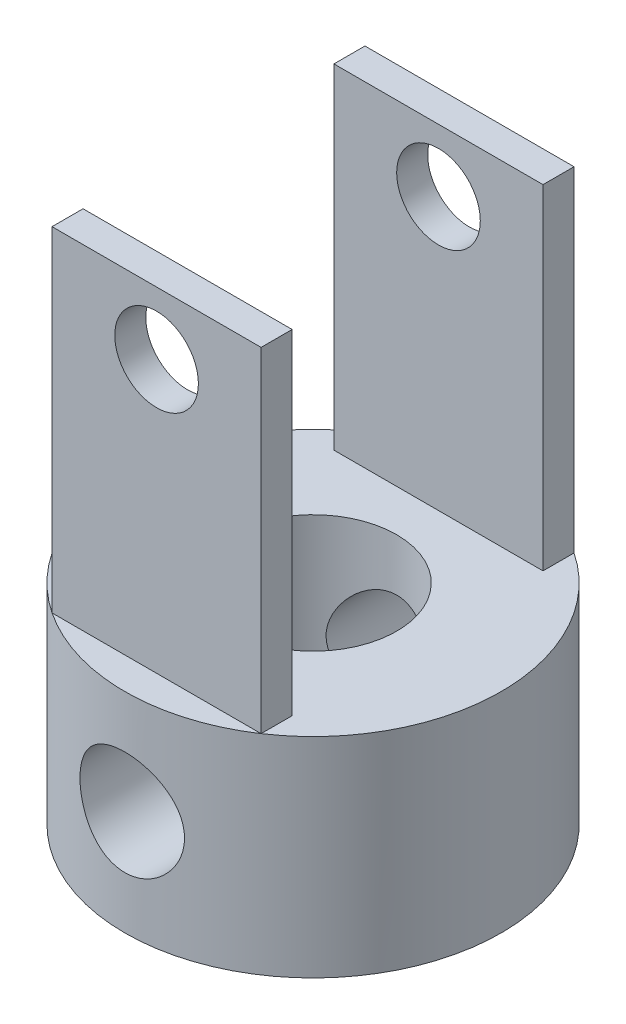
ISO-10303-21;
HEADER;
FILE_DESCRIPTION(('STEP AP214'),'2;1');
FILE_NAME('part.step','',(''),(''),'','','');
FILE_SCHEMA(('AUTOMOTIVE_DESIGN { 1 0 10303 214 1 1 1 1 }'));
ENDSEC;
DATA;
#1=APPLICATION_CONTEXT('core data for automotive mechanical design processes');
#2=APPLICATION_PROTOCOL_DEFINITION('international standard','automotive_design',2000,#1);
#3=PRODUCT_CONTEXT('',#1,'mechanical');
#4=PRODUCT('Part','Part','',(#3));
#5=PRODUCT_RELATED_PRODUCT_CATEGORY('part','',(#4));
#6=PRODUCT_DEFINITION_FORMATION('','',#4);
#7=PRODUCT_DEFINITION_CONTEXT('part definition',#1,'design');
#8=PRODUCT_DEFINITION('design','',#6,#7);
#9=PRODUCT_DEFINITION_SHAPE('','',#8);
#10=(LENGTH_UNIT() NAMED_UNIT(*) SI_UNIT(.MILLI.,.METRE.));
#11=(NAMED_UNIT(*) PLANE_ANGLE_UNIT() SI_UNIT($,.RADIAN.));
#12=(NAMED_UNIT(*) SI_UNIT($,.STERADIAN.) SOLID_ANGLE_UNIT());
#13=UNCERTAINTY_MEASURE_WITH_UNIT(LENGTH_MEASURE(1.E-05),#10,'distance_accuracy_value','');
#14=(GEOMETRIC_REPRESENTATION_CONTEXT(3) GLOBAL_UNCERTAINTY_ASSIGNED_CONTEXT((#13)) GLOBAL_UNIT_ASSIGNED_CONTEXT((#10,
#11,#12)) REPRESENTATION_CONTEXT('',''));
#15=CARTESIAN_POINT('',(0.,0.,0.));
#16=DIRECTION('',(0.,0.,1.));
#17=DIRECTION('',(1.,0.,0.));
#18=AXIS2_PLACEMENT_3D('',#15,#16,#17);
#19=CARTESIAN_POINT('',(0.,5.,0.));
#20=DIRECTION('',(0.,1.,0.));
#21=DIRECTION('',(0.,0.,1.));
#22=AXIS2_PLACEMENT_3D('',#19,#20,#21);
#23=PLANE('',#22);
#24=CARTESIAN_POINT('',(0.,5.,0.));
#25=DIRECTION('',(0.,1.,0.));
#26=DIRECTION('',(0.,0.,1.));
#27=AXIS2_PLACEMENT_3D('',#24,#25,#26);
#28=CIRCLE('',#27,2.);
#29=CARTESIAN_POINT('',(0.,5.,2.));
#30=VERTEX_POINT('',#29);
#31=EDGE_CURVE('E226',#30,#30,#28,.F.);
#32=ORIENTED_EDGE('',*,*,#31,.T.);
#33=EDGE_LOOP('',(#32));
#34=FACE_BOUND('',#33,.T.);
#35=DIRECTION('',(0.,0.,1.));
#36=VECTOR('',#35,1.);
#37=CARTESIAN_POINT('',(-2.5,5.,-3.74165738677394));
#38=LINE('',#37,#36);
#39=CARTESIAN_POINT('',(-2.5,5.,-3.74165738677394));
#40=VERTEX_POINT('',#39);
#41=CARTESIAN_POINT('',(-2.5,5.,-3.));
#42=VERTEX_POINT('',#41);
#43=EDGE_CURVE('E138',#40,#42,#38,.T.);
#44=ORIENTED_EDGE('',*,*,#43,.F.);
#45=CARTESIAN_POINT('',(0.,5.,0.));
#46=DIRECTION('',(0.,1.,0.));
#47=DIRECTION('',(0.,0.,1.));
#48=AXIS2_PLACEMENT_3D('',#45,#46,#47);
#49=CIRCLE('',#48,4.5);
#50=CARTESIAN_POINT('',(-2.5,5.,3.74165738677394));
#51=VERTEX_POINT('',#50);
#52=EDGE_CURVE('E314',#40,#51,#49,.T.);
#53=ORIENTED_EDGE('',*,*,#52,.T.);
#54=DIRECTION('',(0.,0.,1.));
#55=VECTOR('',#54,1.);
#56=CARTESIAN_POINT('',(-2.5,5.,3.74165738677394));
#57=LINE('',#56,#55);
#58=CARTESIAN_POINT('',(-2.5,5.,3.));
#59=VERTEX_POINT('',#58);
#60=EDGE_CURVE('E73',#59,#51,#57,.T.);
#61=ORIENTED_EDGE('',*,*,#60,.F.);
#62=DIRECTION('',(-1.,0.,0.));
#63=VECTOR('',#62,1.);
#64=CARTESIAN_POINT('',(-2.5,5.,3.));
#65=LINE('',#64,#63);
#66=CARTESIAN_POINT('',(2.5,5.,3.));
#67=VERTEX_POINT('',#66);
#68=EDGE_CURVE('E159',#67,#59,#65,.T.);
#69=ORIENTED_EDGE('',*,*,#68,.F.);
#70=DIRECTION('',(0.,0.,-1.));
#71=VECTOR('',#70,1.);
#72=CARTESIAN_POINT('',(2.5,5.,3.74165738677394));
#73=LINE('',#72,#71);
#74=CARTESIAN_POINT('',(2.5,5.,3.74165738677394));
#75=VERTEX_POINT('',#74);
#76=EDGE_CURVE('E161',#75,#67,#73,.T.);
#77=ORIENTED_EDGE('',*,*,#76,.F.);
#78=CARTESIAN_POINT('',(2.5,5.,-3.74165738677394));
#79=VERTEX_POINT('',#78);
#80=EDGE_CURVE('E11',#75,#79,#49,.T.);
#81=ORIENTED_EDGE('',*,*,#80,.T.);
#82=DIRECTION('',(0.,0.,-1.));
#83=VECTOR('',#82,1.);
#84=CARTESIAN_POINT('',(2.5,5.,-3.74165738677394));
#85=LINE('',#84,#83);
#86=CARTESIAN_POINT('',(2.5,5.,-3.));
#87=VERTEX_POINT('',#86);
#88=EDGE_CURVE('E194',#87,#79,#85,.T.);
#89=ORIENTED_EDGE('',*,*,#88,.F.);
#90=DIRECTION('',(1.,0.,0.));
#91=VECTOR('',#90,1.);
#92=CARTESIAN_POINT('',(-2.5,5.,-3.));
#93=LINE('',#92,#91);
#94=EDGE_CURVE('E66',#42,#87,#93,.T.);
#95=ORIENTED_EDGE('',*,*,#94,.F.);
#96=EDGE_LOOP('',(#44,#53,#61,#69,#77,#81,#89,#95));
#97=FACE_BOUND('',#96,.T.);
#98=ADVANCED_FACE('F48',(#34,#97),#23,.T.);
#99=DIRECTION('',(-1.,0.,0.));
#100=VECTOR('',#99,1.);
#101=CARTESIAN_POINT('',(-2.5,5.,-3.74165738677394));
#102=LINE('',#101,#100);
#103=EDGE_CURVE('E135',#79,#40,#102,.T.);
#104=ORIENTED_EDGE('',*,*,#103,.F.);
#105=EDGE_CURVE('E58',#79,#40,#49,.T.);
#106=ORIENTED_EDGE('',*,*,#105,.T.);
#107=EDGE_LOOP('',(#104,#106));
#108=FACE_BOUND('',#107,.T.);
#109=ADVANCED_FACE('F291',(#108),#23,.T.);
#110=CARTESIAN_POINT('',(0.,5.,0.));
#111=DIRECTION('',(0.,-1.,0.));
#112=DIRECTION('',(0.,0.,-1.));
#113=AXIS2_PLACEMENT_3D('',#110,#111,#112);
#114=CYLINDRICAL_SURFACE('',#113,4.5);
#115=CARTESIAN_POINT('',(0.,3.75,-4.5));
#116=CARTESIAN_POINT('',(-0.0688012508831791,3.74999860041477,-4.49999908016929));
#117=CARTESIAN_POINT('',(-0.137617123752667,3.74430068019471,-4.49840674086833));
#118=CARTESIAN_POINT('',(-0.273259475994238,3.72170427173468,-4.49220950198236));
#119=CARTESIAN_POINT('',(-0.340085103663439,3.70480105828628,-4.48760333149253));
#120=CARTESIAN_POINT('',(-0.469769949680301,3.66039128058608,-4.47588565394594));
#121=CARTESIAN_POINT('',(-0.53263439009567,3.63289903130159,-4.46877753030964));
#122=CARTESIAN_POINT('',(-0.652860695241772,3.56814649367313,-4.45280312581996));
#123=CARTESIAN_POINT('',(-0.710222070812297,3.53088533808074,-4.44393668888688));
#124=CARTESIAN_POINT('',(-0.819246784715924,3.44667056615714,-4.4251515781749));
#125=CARTESIAN_POINT('',(-0.870753112808474,3.39951796031246,-4.41521373623696));
#126=CARTESIAN_POINT('',(-0.965238185696338,3.29728372287841,-4.39552607117256));
#127=CARTESIAN_POINT('',(-1.00821573084554,3.24220097772477,-4.38577627467018));
#128=CARTESIAN_POINT('',(-1.08520808580323,3.12439273987068,-4.36737044294547));
#129=CARTESIAN_POINT('',(-1.11903874947837,3.06154279155628,-4.35873847945984));
#130=CARTESIAN_POINT('',(-1.1755895713114,2.93076808235988,-4.34382900808304));
#131=CARTESIAN_POINT('',(-1.19831197336242,2.86284434959184,-4.33755102474248));
#132=CARTESIAN_POINT('',(-1.23144924367956,2.72559721114588,-4.32825883142877));
#133=CARTESIAN_POINT('',(-1.24215036904296,2.65634817836012,-4.32516886003198));
#134=CARTESIAN_POINT('',(-1.25183427077972,2.51697411443717,-4.32237649384804));
#135=CARTESIAN_POINT('',(-1.25081944027303,2.4468492651188,-4.3226734072502));
#136=CARTESIAN_POINT('',(-1.2373267133762,2.30997772127729,-4.32655366801453));
#137=CARTESIAN_POINT('',(-1.22519902270671,2.24319319850379,-4.33003660668585));
#138=CARTESIAN_POINT('',(-1.19038731201905,2.11264637140841,-4.33973517053475));
#139=CARTESIAN_POINT('',(-1.16770238457158,2.04888432739775,-4.3459510306134));
#140=CARTESIAN_POINT('',(-1.11214373134465,1.92529776854472,-4.36050069775752));
#141=CARTESIAN_POINT('',(-1.07915021836991,1.86553013318995,-4.36885918600197));
#142=CARTESIAN_POINT('',(-1.00399440679635,1.75225842440876,-4.386739506843));
#143=CARTESIAN_POINT('',(-0.961830166290601,1.69875568127386,-4.39626158564316));
#144=CARTESIAN_POINT('',(-0.86775561028444,1.59753611956358,-4.41581072126827));
#145=CARTESIAN_POINT('',(-0.815552279702356,1.55009236512015,-4.42584370037791));
#146=CARTESIAN_POINT('',(-0.703806607201035,1.46457426922219,-4.44498199810829));
#147=CARTESIAN_POINT('',(-0.644263925421965,1.42650036189752,-4.45408727373461));
#148=CARTESIAN_POINT('',(-0.519083429338114,1.36066818436993,-4.47040839712755));
#149=CARTESIAN_POINT('',(-0.453416395747747,1.3329628960611,-4.47761448645532));
#150=CARTESIAN_POINT('',(-0.318109988769714,1.28906590155863,-4.48925492501446));
#151=CARTESIAN_POINT('',(-0.24847156412113,1.27287145784343,-4.493689933237));
#152=CARTESIAN_POINT('',(-0.109526607713142,1.25289286322103,-4.49918736483408));
#153=CARTESIAN_POINT('',(-0.0402773058586808,1.24873785509283,-4.5003505382403));
#154=CARTESIAN_POINT('',(0.0979299306365675,1.25192699829243,-4.49946480293159));
#155=CARTESIAN_POINT('',(0.166887897284519,1.25926985164805,-4.49741625678167));
#156=CARTESIAN_POINT('',(0.301206913470861,1.28494333411964,-4.49040265059029));
#157=CARTESIAN_POINT('',(0.366611288163868,1.30306394505752,-4.4854933716758));
#158=CARTESIAN_POINT('',(0.493443118118722,1.3495318676381,-4.47331829169354));
#159=CARTESIAN_POINT('',(0.554870123972382,1.37788033256951,-4.46605222488463));
#160=CARTESIAN_POINT('',(0.673420140405416,1.4446658780465,-4.44973740284175));
#161=CARTESIAN_POINT('',(0.730427061953541,1.48330052432267,-4.44065471340565));
#162=CARTESIAN_POINT('',(0.837277670587,1.56931613580746,-4.42175477128212));
#163=CARTESIAN_POINT('',(0.887119814631375,1.61669898006576,-4.41193736105189));
#164=CARTESIAN_POINT('',(0.979812026944951,1.72060144387835,-4.39229842684379));
#165=CARTESIAN_POINT('',(1.02239957885383,1.77735745155757,-4.3824860820796));
#166=CARTESIAN_POINT('',(1.09745581429008,1.89742063787973,-4.36429693304267));
#167=CARTESIAN_POINT('',(1.12992488482463,1.9607275658426,-4.35592007387163));
#168=CARTESIAN_POINT('',(1.18358105834153,2.09180716988317,-4.34164798956173));
#169=CARTESIAN_POINT('',(1.20483077484783,2.15955263775464,-4.3357390309604));
#170=CARTESIAN_POINT('',(1.23557652495357,2.29784970941676,-4.32707876892783));
#171=CARTESIAN_POINT('',(1.24507587906573,2.36840051463312,-4.32432657344887));
#172=CARTESIAN_POINT('',(1.25184859974321,2.50760577949078,-4.32237038329875));
#173=CARTESIAN_POINT('',(1.24954571014582,2.57623819001194,-4.32304340461176));
#174=CARTESIAN_POINT('',(1.23377143287258,2.71209489379468,-4.32757137052124));
#175=CARTESIAN_POINT('',(1.2203003804941,2.77931922926824,-4.33142621959091));
#176=CARTESIAN_POINT('',(1.18282724248614,2.90986723391807,-4.34180718808003));
#177=CARTESIAN_POINT('',(1.15892214641117,2.97322084264776,-4.34830866913275));
#178=CARTESIAN_POINT('',(1.10133451670734,3.09506742250732,-4.36324916052054));
#179=CARTESIAN_POINT('',(1.06765033358688,3.15355957148569,-4.37168849767404));
#180=CARTESIAN_POINT('',(0.990206962020971,3.26602765282517,-4.38988810785379));
#181=CARTESIAN_POINT('',(0.946162084346266,3.31980147668272,-4.39968178982262));
#182=CARTESIAN_POINT('',(0.849781527450663,3.41933237205346,-4.41930831909362));
#183=CARTESIAN_POINT('',(0.797443795628191,3.46508745289098,-4.4291411755031));
#184=CARTESIAN_POINT('',(0.684460232307881,3.54835813657808,-4.44801839581548));
#185=CARTESIAN_POINT('',(0.623646258932174,3.58565162331068,-4.45703841192792));
#186=CARTESIAN_POINT('',(0.496361982692841,3.64942813928948,-4.47299974900605));
#187=CARTESIAN_POINT('',(0.429895030176724,3.67591751858102,-4.47994229035336));
#188=CARTESIAN_POINT('',(0.3031454837667,3.7142200807347,-4.4901607483195));
#189=CARTESIAN_POINT('',(0.243364402168741,3.72760478759287,-4.49382245661855));
#190=CARTESIAN_POINT('',(0.122392625693409,3.74549484582254,-4.49874234976285));
#191=CARTESIAN_POINT('',(0.0612020980194152,3.75000124499993,-4.50000081823467));
#192=CARTESIAN_POINT('',(0.,3.75,-4.5));
#193=B_SPLINE_CURVE_WITH_KNOTS('',3,(#115,#116,#117,#118,#119,#120,#121,#122,#123,#124,#125,
#126,#127,#128,#129,#130,#131,#132,#133,#134,#135,#136,#137,#138,#139,#140,#141,#142,#143,#144,
#145,#146,#147,#148,#149,#150,#151,#152,#153,#154,#155,#156,#157,#158,#159,#160,#161,#162,#163,
#164,#165,#166,#167,#168,#169,#170,#171,#172,#173,#174,#175,#176,#177,#178,#179,#180,#181,#182,
#183,#184,#185,#186,#187,#188,#189,#190,#191,#192),.UNSPECIFIED.,.T.,.F.,(4,2,2,2,2,2,2,2,2,2,2,
2,2,2,2,2,2,2,2,2,2,2,2,2,2,2,2,2,2,2,2,2,2,2,2,2,2,2,4),(0.,0.20617919309949,0.412445386147261,
0.618433707942854,0.824440322837931,1.03507624325264,1.24574177043995,1.46037690323672,
1.67496866133384,1.88433431939189,2.09365721284144,2.29660232990422,2.49956489399153,
2.70497960040655,2.91043784592675,3.12319493838161,3.33596188658146,3.54980165635949,
3.76359055350007,3.97072010588426,4.17782627748477,4.38102317477486,4.58424299163038,
4.79168948884226,4.99918059600964,5.21305991702851,5.426931056682,5.63959564853972,
5.85220013017267,6.05722599244308,6.26224569952548,6.46539893556025,6.66858645848128,
6.8782191327377,7.0879037754062,7.30258090584732,7.51713167871718,7.70055986525029,
7.88396640253934),.UNSPECIFIED.);
#194=CARTESIAN_POINT('',(0.,3.75,-4.5));
#195=VERTEX_POINT('',#194);
#196=EDGE_CURVE('E321',#195,#195,#193,.T.);
#197=ORIENTED_EDGE('',*,*,#196,.T.);
#198=EDGE_LOOP('',(#197));
#199=FACE_BOUND('',#198,.T.);
#200=CARTESIAN_POINT('',(1.25,2.5,4.32290411644765));
#201=CARTESIAN_POINT('',(1.24999857498244,2.43125652335593,4.32290518747009));
#202=CARTESIAN_POINT('',(1.24430988712604,2.36249837996371,4.32456180468303));
#203=CARTESIAN_POINT('',(1.22175346858591,2.22697570228416,4.33098737036507));
#204=CARTESIAN_POINT('',(1.20488074482037,2.1602120723611,4.3357577089319));
#205=CARTESIAN_POINT('',(1.16056004340388,2.03065883662032,4.34782967711429));
#206=CARTESIAN_POINT('',(1.13312779872145,1.96786347962317,4.35512753927727));
#207=CARTESIAN_POINT('',(1.06851688708743,1.84775453897228,4.37142737531087));
#208=CARTESIAN_POINT('',(1.03133723028468,1.79044151285728,4.38042952222604));
#209=CARTESIAN_POINT('',(0.947207659537757,1.68136907220858,4.39939741122667));
#210=CARTESIAN_POINT('',(0.900040389354681,1.62978044118192,4.40938137769938));
#211=CARTESIAN_POINT('',(0.797741434800139,1.53513458048033,4.42903119907275));
#212=CARTESIAN_POINT('',(0.74260886547861,1.4920783000175,4.43869701848036));
#213=CARTESIAN_POINT('',(0.624750214452997,1.41499776941939,4.45682601370986));
#214=CARTESIAN_POINT('',(0.561908163805416,1.3811447040778,4.46526519213644));
#215=CARTESIAN_POINT('',(0.431150181024712,1.32455036312015,4.47978009156482));
#216=CARTESIAN_POINT('',(0.363235182945446,1.30180704771302,4.48585624638467));
#217=CARTESIAN_POINT('',(0.226043180102931,1.26863452726371,4.49483159170207));
#218=CARTESIAN_POINT('',(0.156841487533508,1.25791447886935,4.49780569025352));
#219=CARTESIAN_POINT('',(0.0175622284393639,1.24817627167198,4.50050433692141));
#220=CARTESIAN_POINT('',(-0.0525151772113885,1.24915599422164,4.50022947337466));
#221=CARTESIAN_POINT('',(-0.189527123576272,1.26258777619191,4.49651543187109));
#222=CARTESIAN_POINT('',(-0.256495205022549,1.27472538198454,4.49316299037632));
#223=CARTESIAN_POINT('',(-0.38740374166124,1.30961856911628,4.48377380049515));
#224=CARTESIAN_POINT('',(-0.451344017003044,1.33237478032754,4.47773689287315));
#225=CARTESIAN_POINT('',(-0.575166795899741,1.38809104029157,4.46353125303123));
#226=CARTESIAN_POINT('',(-0.634999513293939,1.42115595476214,4.45534075392173));
#227=CARTESIAN_POINT('',(-0.748372286544129,1.49646980790988,4.43770610675039));
#228=CARTESIAN_POINT('',(-0.801911023420063,1.53872066634598,4.42826169679617));
#229=CARTESIAN_POINT('',(-0.903053380191149,1.63286432888863,4.40876831613152));
#230=CARTESIAN_POINT('',(-0.950400625294905,1.6850309028229,4.39870968477246));
#231=CARTESIAN_POINT('',(-1.03574054042556,1.79666633756107,4.37940191575936));
#232=CARTESIAN_POINT('',(-1.07373253513777,1.85613572505908,4.37015283657441));
#233=CARTESIAN_POINT('',(-1.13950119060979,1.98128236070626,4.35347006971972));
#234=CARTESIAN_POINT('',(-1.16720250820497,2.04700113465338,4.34604990034145));
#235=CARTESIAN_POINT('',(-1.21107648821783,2.18242179787883,4.33403011245413));
#236=CARTESIAN_POINT('',(-1.22725229229959,2.25212259612334,4.32942972536695));
#237=CARTESIAN_POINT('',(-1.2471622774305,2.39111725699411,4.3237357416584));
#238=CARTESIAN_POINT('',(-1.25128124671117,2.46035161739731,4.32253373160699));
#239=CARTESIAN_POINT('',(-1.24802546030741,2.59852099522208,4.32347494363827));
#240=CARTESIAN_POINT('',(-1.24065204762324,2.66745604667692,4.3256177748427));
#241=CARTESIAN_POINT('',(-1.21496120714199,2.80154887335,4.33290194955527));
#242=CARTESIAN_POINT('',(-1.19688029932166,2.86675583442476,4.33797843412407));
#243=CARTESIAN_POINT('',(-1.15055629594164,2.99321011354927,4.35049332079077));
#244=CARTESIAN_POINT('',(-1.12231179178945,3.05445688135949,4.35793205025995));
#245=CARTESIAN_POINT('',(-1.05569785607915,3.17284768427921,4.3745518120738));
#246=CARTESIAN_POINT('',(-1.01710533632441,3.22986088551919,4.38376979927329));
#247=CARTESIAN_POINT('',(-0.931163609237379,3.33674312203778,4.40282499705416));
#248=CARTESIAN_POINT('',(-0.883812610803321,3.38661069233221,4.41266233402014));
#249=CARTESIAN_POINT('',(-0.779908718233593,3.47941073528424,4.43222509969555));
#250=CARTESIAN_POINT('',(-0.723111799354903,3.52207340503389,4.44193710647942));
#251=CARTESIAN_POINT('',(-0.602941556434743,3.59726198553872,4.45983701439328));
#252=CARTESIAN_POINT('',(-0.539568581085917,3.62978843339709,4.46802499626981));
#253=CARTESIAN_POINT('',(-0.408489197616628,3.6834747959117,4.48190163893738));
#254=CARTESIAN_POINT('',(-0.340820050525332,3.70472058303361,4.48760911989691));
#255=CARTESIAN_POINT('',(-0.202688156447679,3.73548408672038,4.49596471419449));
#256=CARTESIAN_POINT('',(-0.132226089798137,3.74500464157181,4.49861356791422));
#257=CARTESIAN_POINT('',(0.0069800761788269,3.75185716484314,4.50051521104671));
#258=CARTESIAN_POINT('',(0.075703532294838,3.74958335354531,4.49987784493188));
#259=CARTESIAN_POINT('',(0.211750309863845,3.73383571875471,4.49553044423232));
#260=CARTESIAN_POINT('',(0.279073691936855,3.7203623812151,4.49182054296648));
#261=CARTESIAN_POINT('',(0.409892491734703,3.68282838818581,4.48176992045676));
#262=CARTESIAN_POINT('',(0.473414328140757,3.6588537010331,4.47545058468407));
#263=CARTESIAN_POINT('',(0.59556960394138,3.6010740308847,4.46083910148551));
#264=CARTESIAN_POINT('',(0.654202313356983,3.56726758331173,4.45254666017165));
#265=CARTESIAN_POINT('',(0.766725560865268,3.4896640286411,4.43457698674557));
#266=CARTESIAN_POINT('',(0.820433633237658,3.44560995696169,4.424867058695));
#267=CARTESIAN_POINT('',(0.919827817865878,3.34924103477822,4.40527960400557));
#268=CARTESIAN_POINT('',(0.965511754330254,3.29692395099116,4.39540203270303));
#269=CARTESIAN_POINT('',(1.04867120954826,3.18397774126432,4.37631776775268));
#270=CARTESIAN_POINT('',(1.08591898377728,3.12317680517996,4.36713335303392));
#271=CARTESIAN_POINT('',(1.14961326326322,2.99592800635586,4.35080192911572));
#272=CARTESIAN_POINT('',(1.17606625417817,2.92948356339495,4.3436536973308));
#273=CARTESIAN_POINT('',(1.21429747440485,2.80281993514138,4.33310672877768));
#274=CARTESIAN_POINT('',(1.22765281702807,2.74310529722462,4.32931330336832));
#275=CARTESIAN_POINT('',(1.2455041024603,2.62226417588502,4.32421169234928));
#276=CARTESIAN_POINT('',(1.25000126735755,2.56113788839299,4.32290316392016));
#277=CARTESIAN_POINT('',(1.25,2.5,4.32290411644765));
#278=B_SPLINE_CURVE_WITH_KNOTS('',3,(#200,#201,#202,#203,#204,#205,#206,#207,#208,#209,#210,
#211,#212,#213,#214,#215,#216,#217,#218,#219,#220,#221,#222,#223,#224,#225,#226,#227,#228,#229,
#230,#231,#232,#233,#234,#235,#236,#237,#238,#239,#240,#241,#242,#243,#244,#245,#246,#247,#248,
#249,#250,#251,#252,#253,#254,#255,#256,#257,#258,#259,#260,#261,#262,#263,#264,#265,#266,#267,
#268,#269,#270,#271,#272,#273,#274,#275,#276,#277),.UNSPECIFIED.,.T.,.F.,(4,2,2,2,2,2,2,2,2,2,2,
2,2,2,2,2,2,2,2,2,2,2,2,2,2,2,2,2,2,2,2,2,2,2,2,2,2,2,4),(0.,0.20600539584448,0.412102824227257,
0.617894362639286,0.823706807313081,1.03456947880015,1.24545559531203,1.46003098375315,
1.67456696053961,1.8837931561237,2.09298146465861,2.29644933759041,2.49992928132028,
2.70555066651715,2.91121506564783,3.12371437775741,3.336229024771,3.55027028703842,
3.76425318285945,3.97132818882307,4.17837899780676,4.38101838846584,4.58368587413355,
4.79113333818944,4.99862327207956,5.2126875312967,5.42674044564049,5.63913966265412,
5.85148745480915,6.05678432365223,6.26207228502411,6.46571019932815,6.66937846387956,
6.87884344725019,7.08836514088847,7.30300439729128,7.51751450485885,7.70075331478743,
7.88396684302815),.UNSPECIFIED.);
#279=CARTESIAN_POINT('',(1.25,2.5,4.32290411644765));
#280=VERTEX_POINT('',#279);
#281=EDGE_CURVE('E232',#280,#280,#278,.T.);
#282=ORIENTED_EDGE('',*,*,#281,.T.);
#283=EDGE_LOOP('',(#282));
#284=FACE_BOUND('',#283,.T.);
#285=ORIENTED_EDGE('',*,*,#80,.F.);
#286=EDGE_CURVE('E59',#51,#75,#49,.T.);
#287=ORIENTED_EDGE('',*,*,#286,.F.);
#288=ORIENTED_EDGE('',*,*,#52,.F.);
#289=ORIENTED_EDGE('',*,*,#105,.F.);
#290=EDGE_LOOP('',(#285,#287,#288,#289));
#291=FACE_BOUND('',#290,.T.);
#292=CARTESIAN_POINT('',(0.,0.,0.));
#293=DIRECTION('',(0.,1.,0.));
#294=DIRECTION('',(0.,0.,1.));
#295=AXIS2_PLACEMENT_3D('',#292,#293,#294);
#296=CIRCLE('',#295,4.5);
#297=CARTESIAN_POINT('',(0.,0.,4.5));
#298=VERTEX_POINT('',#297);
#299=EDGE_CURVE('E53',#298,#298,#296,.T.);
#300=ORIENTED_EDGE('',*,*,#299,.T.);
#301=EDGE_LOOP('',(#300));
#302=FACE_BOUND('',#301,.T.);
#303=ADVANCED_FACE('F50',(#199,#284,#291,#302),#114,.T.);
#304=DIRECTION('',(1.,0.,0.));
#305=VECTOR('',#304,1.);
#306=CARTESIAN_POINT('',(-2.5,5.,3.74165738677394));
#307=LINE('',#306,#305);
#308=EDGE_CURVE('E165',#51,#75,#307,.T.);
#309=ORIENTED_EDGE('',*,*,#308,.F.);
#310=ORIENTED_EDGE('',*,*,#286,.T.);
#311=EDGE_LOOP('',(#309,#310));
#312=FACE_BOUND('',#311,.T.);
#313=ADVANCED_FACE('F288',(#312),#23,.T.);
#314=CARTESIAN_POINT('',(0.,0.,0.));
#315=DIRECTION('',(0.,1.,0.));
#316=DIRECTION('',(0.,0.,1.));
#317=AXIS2_PLACEMENT_3D('',#314,#315,#316);
#318=PLANE('',#317);
#319=CARTESIAN_POINT('',(0.,0.,0.));
#320=DIRECTION('',(0.,-1.,0.));
#321=DIRECTION('',(0.,0.,-1.));
#322=AXIS2_PLACEMENT_3D('',#319,#320,#321);
#323=CIRCLE('',#322,2.);
#324=CARTESIAN_POINT('',(0.,0.,-2.));
#325=VERTEX_POINT('',#324);
#326=EDGE_CURVE('E229',#325,#325,#323,.T.);
#327=ORIENTED_EDGE('',*,*,#326,.F.);
#328=EDGE_LOOP('',(#327));
#329=FACE_BOUND('',#328,.T.);
#330=ORIENTED_EDGE('',*,*,#299,.F.);
#331=EDGE_LOOP('',(#330));
#332=FACE_BOUND('',#331,.T.);
#333=ADVANCED_FACE('F277',(#329,#332),#318,.F.);
#334=CARTESIAN_POINT('',(-2.5,13.,3.74165738677394));
#335=DIRECTION('',(1.,0.,0.));
#336=DIRECTION('',(0.,0.,-1.));
#337=AXIS2_PLACEMENT_3D('',#334,#335,#336);
#338=PLANE('',#337);
#339=ORIENTED_EDGE('',*,*,#60,.T.);
#340=DIRECTION('',(0.,-1.,0.));
#341=VECTOR('',#340,1.);
#342=CARTESIAN_POINT('',(-2.5,13.,3.74165738677394));
#343=LINE('',#342,#341);
#344=CARTESIAN_POINT('',(-2.5,13.,3.74165738677394));
#345=VERTEX_POINT('',#344);
#346=EDGE_CURVE('E145',#345,#51,#343,.T.);
#347=ORIENTED_EDGE('',*,*,#346,.F.);
#348=DIRECTION('',(0.,0.,1.));
#349=VECTOR('',#348,1.);
#350=CARTESIAN_POINT('',(-2.5,13.,3.74165738677394));
#351=LINE('',#350,#349);
#352=CARTESIAN_POINT('',(-2.5,13.,3.));
#353=VERTEX_POINT('',#352);
#354=EDGE_CURVE('E162',#353,#345,#351,.T.);
#355=ORIENTED_EDGE('',*,*,#354,.F.);
#356=DIRECTION('',(0.,-1.,0.));
#357=VECTOR('',#356,1.);
#358=CARTESIAN_POINT('',(-2.5,13.,3.));
#359=LINE('',#358,#357);
#360=EDGE_CURVE('E155',#353,#59,#359,.T.);
#361=ORIENTED_EDGE('',*,*,#360,.T.);
#362=EDGE_LOOP('',(#339,#347,#355,#361));
#363=FACE_BOUND('',#362,.T.);
#364=ADVANCED_FACE('F183',(#363),#338,.F.);
#365=CARTESIAN_POINT('',(-2.5,13.,3.74165738677394));
#366=DIRECTION('',(0.,0.,-1.));
#367=DIRECTION('',(-1.,0.,0.));
#368=AXIS2_PLACEMENT_3D('',#365,#366,#367);
#369=PLANE('',#368);
#370=CARTESIAN_POINT('',(0.,11.5,3.74165738677394));
#371=DIRECTION('',(0.,0.,1.));
#372=DIRECTION('',(1.,0.,0.));
#373=AXIS2_PLACEMENT_3D('',#370,#371,#372);
#374=CIRCLE('',#373,1.);
#375=CARTESIAN_POINT('',(1.,11.5,3.74165738677394));
#376=VERTEX_POINT('',#375);
#377=EDGE_CURVE('E223',#376,#376,#374,.T.);
#378=ORIENTED_EDGE('',*,*,#377,.F.);
#379=EDGE_LOOP('',(#378));
#380=FACE_BOUND('',#379,.T.);
#381=ORIENTED_EDGE('',*,*,#308,.T.);
#382=DIRECTION('',(0.,-1.,0.));
#383=VECTOR('',#382,1.);
#384=CARTESIAN_POINT('',(2.5,13.,3.74165738677394));
#385=LINE('',#384,#383);
#386=CARTESIAN_POINT('',(2.5,13.,3.74165738677394));
#387=VERTEX_POINT('',#386);
#388=EDGE_CURVE('E148',#387,#75,#385,.T.);
#389=ORIENTED_EDGE('',*,*,#388,.F.);
#390=DIRECTION('',(1.,0.,0.));
#391=VECTOR('',#390,1.);
#392=CARTESIAN_POINT('',(-2.5,13.,3.74165738677394));
#393=LINE('',#392,#391);
#394=EDGE_CURVE('E172',#345,#387,#393,.T.);
#395=ORIENTED_EDGE('',*,*,#394,.F.);
#396=ORIENTED_EDGE('',*,*,#346,.T.);
#397=EDGE_LOOP('',(#381,#389,#395,#396));
#398=FACE_BOUND('',#397,.T.);
#399=ADVANCED_FACE('F185',(#380,#398),#369,.F.);
#400=CARTESIAN_POINT('',(2.5,13.,3.74165738677394));
#401=DIRECTION('',(-1.,0.,0.));
#402=DIRECTION('',(0.,0.,1.));
#403=AXIS2_PLACEMENT_3D('',#400,#401,#402);
#404=PLANE('',#403);
#405=ORIENTED_EDGE('',*,*,#76,.T.);
#406=DIRECTION('',(0.,-1.,0.));
#407=VECTOR('',#406,1.);
#408=CARTESIAN_POINT('',(2.5,13.,3.));
#409=LINE('',#408,#407);
#410=CARTESIAN_POINT('',(2.5,13.,3.));
#411=VERTEX_POINT('',#410);
#412=EDGE_CURVE('E152',#411,#67,#409,.T.);
#413=ORIENTED_EDGE('',*,*,#412,.F.);
#414=DIRECTION('',(0.,0.,-1.));
#415=VECTOR('',#414,1.);
#416=CARTESIAN_POINT('',(2.5,13.,3.74165738677394));
#417=LINE('',#416,#415);
#418=EDGE_CURVE('E170',#387,#411,#417,.T.);
#419=ORIENTED_EDGE('',*,*,#418,.F.);
#420=ORIENTED_EDGE('',*,*,#388,.T.);
#421=EDGE_LOOP('',(#405,#413,#419,#420));
#422=FACE_BOUND('',#421,.T.);
#423=ADVANCED_FACE('F189',(#422),#404,.F.);
#424=CARTESIAN_POINT('',(-2.5,13.,3.));
#425=DIRECTION('',(0.,0.,1.));
#426=DIRECTION('',(1.,0.,0.));
#427=AXIS2_PLACEMENT_3D('',#424,#425,#426);
#428=PLANE('',#427);
#429=CARTESIAN_POINT('',(0.,11.5,3.));
#430=DIRECTION('',(0.,0.,1.));
#431=DIRECTION('',(1.,0.,0.));
#432=AXIS2_PLACEMENT_3D('',#429,#430,#431);
#433=CIRCLE('',#432,1.);
#434=CARTESIAN_POINT('',(1.,11.5,3.));
#435=VERTEX_POINT('',#434);
#436=EDGE_CURVE('E149',#435,#435,#433,.T.);
#437=ORIENTED_EDGE('',*,*,#436,.T.);
#438=EDGE_LOOP('',(#437));
#439=FACE_BOUND('',#438,.T.);
#440=ORIENTED_EDGE('',*,*,#68,.T.);
#441=ORIENTED_EDGE('',*,*,#360,.F.);
#442=DIRECTION('',(-1.,0.,0.));
#443=VECTOR('',#442,1.);
#444=CARTESIAN_POINT('',(-2.5,13.,3.));
#445=LINE('',#444,#443);
#446=EDGE_CURVE('E158',#411,#353,#445,.T.);
#447=ORIENTED_EDGE('',*,*,#446,.F.);
#448=ORIENTED_EDGE('',*,*,#412,.T.);
#449=EDGE_LOOP('',(#440,#441,#447,#448));
#450=FACE_BOUND('',#449,.T.);
#451=ADVANCED_FACE('F192',(#439,#450),#428,.F.);
#452=CARTESIAN_POINT('',(0.,13.,0.));
#453=DIRECTION('',(0.,-1.,0.));
#454=DIRECTION('',(0.,0.,-1.));
#455=AXIS2_PLACEMENT_3D('',#452,#453,#454);
#456=PLANE('',#455);
#457=ORIENTED_EDGE('',*,*,#354,.T.);
#458=ORIENTED_EDGE('',*,*,#394,.T.);
#459=ORIENTED_EDGE('',*,*,#418,.T.);
#460=ORIENTED_EDGE('',*,*,#446,.T.);
#461=EDGE_LOOP('',(#457,#458,#459,#460));
#462=FACE_BOUND('',#461,.T.);
#463=ADVANCED_FACE('F178',(#462),#456,.F.);
#464=CARTESIAN_POINT('',(-2.5,13.,-3.74165738677394));
#465=DIRECTION('',(1.,0.,0.));
#466=DIRECTION('',(0.,0.,-1.));
#467=AXIS2_PLACEMENT_3D('',#464,#465,#466);
#468=PLANE('',#467);
#469=ORIENTED_EDGE('',*,*,#43,.T.);
#470=DIRECTION('',(0.,-1.,0.));
#471=VECTOR('',#470,1.);
#472=CARTESIAN_POINT('',(-2.5,13.,-3.));
#473=LINE('',#472,#471);
#474=CARTESIAN_POINT('',(-2.5,13.,-3.));
#475=VERTEX_POINT('',#474);
#476=EDGE_CURVE('E119',#475,#42,#473,.T.);
#477=ORIENTED_EDGE('',*,*,#476,.F.);
#478=DIRECTION('',(0.,0.,1.));
#479=VECTOR('',#478,1.);
#480=CARTESIAN_POINT('',(-2.5,13.,-3.74165738677394));
#481=LINE('',#480,#479);
#482=CARTESIAN_POINT('',(-2.5,13.,-3.74165738677394));
#483=VERTEX_POINT('',#482);
#484=EDGE_CURVE('E126',#483,#475,#481,.T.);
#485=ORIENTED_EDGE('',*,*,#484,.F.);
#486=DIRECTION('',(0.,-1.,0.));
#487=VECTOR('',#486,1.);
#488=CARTESIAN_POINT('',(-2.5,13.,-3.74165738677394));
#489=LINE('',#488,#487);
#490=EDGE_CURVE('E207',#483,#40,#489,.T.);
#491=ORIENTED_EDGE('',*,*,#490,.T.);
#492=EDGE_LOOP('',(#469,#477,#485,#491));
#493=FACE_BOUND('',#492,.T.);
#494=ADVANCED_FACE('F137',(#493),#468,.F.);
#495=CARTESIAN_POINT('',(-2.5,13.,-3.));
#496=DIRECTION('',(0.,0.,-1.));
#497=DIRECTION('',(-1.,0.,0.));
#498=AXIS2_PLACEMENT_3D('',#495,#496,#497);
#499=PLANE('',#498);
#500=CARTESIAN_POINT('',(0.,11.5,-3.));
#501=DIRECTION('',(0.,0.,-1.));
#502=DIRECTION('',(-1.,0.,0.));
#503=AXIS2_PLACEMENT_3D('',#500,#501,#502);
#504=CIRCLE('',#503,1.);
#505=CARTESIAN_POINT('',(-1.,11.5,-3.));
#506=VERTEX_POINT('',#505);
#507=EDGE_CURVE('E217',#506,#506,#504,.T.);
#508=ORIENTED_EDGE('',*,*,#507,.T.);
#509=EDGE_LOOP('',(#508));
#510=FACE_BOUND('',#509,.T.);
#511=ORIENTED_EDGE('',*,*,#94,.T.);
#512=DIRECTION('',(0.,-1.,0.));
#513=VECTOR('',#512,1.);
#514=CARTESIAN_POINT('',(2.5,13.,-3.));
#515=LINE('',#514,#513);
#516=CARTESIAN_POINT('',(2.5,13.,-3.));
#517=VERTEX_POINT('',#516);
#518=EDGE_CURVE('E122',#517,#87,#515,.T.);
#519=ORIENTED_EDGE('',*,*,#518,.F.);
#520=DIRECTION('',(1.,0.,0.));
#521=VECTOR('',#520,1.);
#522=CARTESIAN_POINT('',(-2.5,13.,-3.));
#523=LINE('',#522,#521);
#524=EDGE_CURVE('E115',#475,#517,#523,.T.);
#525=ORIENTED_EDGE('',*,*,#524,.F.);
#526=ORIENTED_EDGE('',*,*,#476,.T.);
#527=EDGE_LOOP('',(#511,#519,#525,#526));
#528=FACE_BOUND('',#527,.T.);
#529=ADVANCED_FACE('F117',(#510,#528),#499,.F.);
#530=CARTESIAN_POINT('',(2.5,13.,-3.74165738677394));
#531=DIRECTION('',(-1.,0.,0.));
#532=DIRECTION('',(0.,0.,1.));
#533=AXIS2_PLACEMENT_3D('',#530,#531,#532);
#534=PLANE('',#533);
#535=ORIENTED_EDGE('',*,*,#88,.T.);
#536=DIRECTION('',(0.,-1.,0.));
#537=VECTOR('',#536,1.);
#538=CARTESIAN_POINT('',(2.5,13.,-3.74165738677394));
#539=LINE('',#538,#537);
#540=CARTESIAN_POINT('',(2.5,13.,-3.74165738677394));
#541=VERTEX_POINT('',#540);
#542=EDGE_CURVE('E141',#541,#79,#539,.T.);
#543=ORIENTED_EDGE('',*,*,#542,.F.);
#544=DIRECTION('',(0.,0.,-1.));
#545=VECTOR('',#544,1.);
#546=CARTESIAN_POINT('',(2.5,13.,-3.74165738677394));
#547=LINE('',#546,#545);
#548=EDGE_CURVE('E125',#517,#541,#547,.T.);
#549=ORIENTED_EDGE('',*,*,#548,.F.);
#550=ORIENTED_EDGE('',*,*,#518,.T.);
#551=EDGE_LOOP('',(#535,#543,#549,#550));
#552=FACE_BOUND('',#551,.T.);
#553=ADVANCED_FACE('F202',(#552),#534,.F.);
#554=CARTESIAN_POINT('',(-2.5,13.,-3.74165738677394));
#555=DIRECTION('',(0.,0.,1.));
#556=DIRECTION('',(1.,0.,0.));
#557=AXIS2_PLACEMENT_3D('',#554,#555,#556);
#558=PLANE('',#557);
#559=CARTESIAN_POINT('',(0.,11.5,-3.74165738677394));
#560=DIRECTION('',(0.,0.,1.));
#561=DIRECTION('',(1.,0.,0.));
#562=AXIS2_PLACEMENT_3D('',#559,#560,#561);
#563=CIRCLE('',#562,1.);
#564=CARTESIAN_POINT('',(1.,11.5,-3.74165738677394));
#565=VERTEX_POINT('',#564);
#566=EDGE_CURVE('E220',#565,#565,#563,.F.);
#567=ORIENTED_EDGE('',*,*,#566,.F.);
#568=EDGE_LOOP('',(#567));
#569=FACE_BOUND('',#568,.T.);
#570=ORIENTED_EDGE('',*,*,#103,.T.);
#571=ORIENTED_EDGE('',*,*,#490,.F.);
#572=DIRECTION('',(-1.,0.,0.));
#573=VECTOR('',#572,1.);
#574=CARTESIAN_POINT('',(-2.5,13.,-3.74165738677394));
#575=LINE('',#574,#573);
#576=EDGE_CURVE('E131',#541,#483,#575,.T.);
#577=ORIENTED_EDGE('',*,*,#576,.F.);
#578=ORIENTED_EDGE('',*,*,#542,.T.);
#579=EDGE_LOOP('',(#570,#571,#577,#578));
#580=FACE_BOUND('',#579,.T.);
#581=ADVANCED_FACE('F206',(#569,#580),#558,.F.);
#582=CARTESIAN_POINT('',(0.,13.,0.));
#583=DIRECTION('',(0.,1.,0.));
#584=DIRECTION('',(0.,0.,1.));
#585=AXIS2_PLACEMENT_3D('',#582,#583,#584);
#586=PLANE('',#585);
#587=ORIENTED_EDGE('',*,*,#484,.T.);
#588=ORIENTED_EDGE('',*,*,#524,.T.);
#589=ORIENTED_EDGE('',*,*,#548,.T.);
#590=ORIENTED_EDGE('',*,*,#576,.T.);
#591=EDGE_LOOP('',(#587,#588,#589,#590));
#592=FACE_BOUND('',#591,.T.);
#593=ADVANCED_FACE('F129',(#592),#586,.T.);
#594=CARTESIAN_POINT('',(0.,11.5,-6.57008451152013));
#595=DIRECTION('',(0.,0.,1.));
#596=DIRECTION('',(1.,0.,0.));
#597=AXIS2_PLACEMENT_3D('',#594,#595,#596);
#598=CYLINDRICAL_SURFACE('',#597,1.);
#599=ORIENTED_EDGE('',*,*,#566,.T.);
#600=EDGE_LOOP('',(#599));
#601=FACE_BOUND('',#600,.T.);
#602=ORIENTED_EDGE('',*,*,#507,.F.);
#603=EDGE_LOOP('',(#602));
#604=FACE_BOUND('',#603,.T.);
#605=ADVANCED_FACE('F261',(#601,#604),#598,.F.);
#606=ORIENTED_EDGE('',*,*,#377,.T.);
#607=EDGE_LOOP('',(#606));
#608=FACE_BOUND('',#607,.T.);
#609=ORIENTED_EDGE('',*,*,#436,.F.);
#610=EDGE_LOOP('',(#609));
#611=FACE_BOUND('',#610,.T.);
#612=ADVANCED_FACE('F257',(#608,#611),#598,.F.);
#613=CARTESIAN_POINT('',(0.,10.6568542494924,0.));
#614=DIRECTION('',(0.,-1.,0.));
#615=DIRECTION('',(0.,0.,-1.));
#616=AXIS2_PLACEMENT_3D('',#613,#614,#615);
#617=CYLINDRICAL_SURFACE('',#616,2.);
#618=CARTESIAN_POINT('',(-1.25,2.5,-1.5612494995996));
#619=CARTESIAN_POINT('',(-1.24999462210485,2.43787971819707,-1.56125800072559));
#620=CARTESIAN_POINT('',(-1.24532693849665,2.37566216462975,-1.56502642708837));
#621=CARTESIAN_POINT('',(-1.22698950832934,2.25332367992062,-1.57943717205478));
#622=CARTESIAN_POINT('',(-1.21329530430551,2.19320891363476,-1.59009816464115));
#623=CARTESIAN_POINT('',(-1.17788073911871,2.07721767730116,-1.61650085329041));
#624=CARTESIAN_POINT('',(-1.15622993332784,2.02130939131819,-1.63219837418033));
#625=CARTESIAN_POINT('',(-1.10571945561924,1.91399113836185,-1.66682950714432));
#626=CARTESIAN_POINT('',(-1.07685958706091,1.8625812941435,-1.68576320748676));
#627=CARTESIAN_POINT('',(-1.00823937928364,1.75813484552302,-1.72779611374711));
#628=CARTESIAN_POINT('',(-0.967536093692502,1.70580525916741,-1.75111338227346));
#629=CARTESIAN_POINT('',(-0.878308664496878,1.60811730085503,-1.79752820854877));
#630=CARTESIAN_POINT('',(-0.829777781297412,1.56276500271608,-1.82062555863329));
#631=CARTESIAN_POINT('',(-0.71918666525849,1.47489641485188,-1.86729453891009));
#632=CARTESIAN_POINT('',(-0.656200568910555,1.4333823318957,-1.8905872224145));
#633=CARTESIAN_POINT('',(-0.522404070837315,1.36187479523684,-1.9318323169914));
#634=CARTESIAN_POINT('',(-0.45160150647824,1.33186993424875,-1.94979001179838));
#635=CARTESIAN_POINT('',(-0.311776878362018,1.28751768939294,-1.97669841318201));
#636=CARTESIAN_POINT('',(-0.24330563604724,1.27188858360307,-1.98637922422038));
#637=CARTESIAN_POINT('',(-0.104105100662262,1.2523679303566,-1.99850544379202));
#638=CARTESIAN_POINT('',(-0.033378260564026,1.24846404387945,-2.00095845843657));
#639=CARTESIAN_POINT('',(0.098065828421341,1.25235568927761,-1.99852909107528));
#640=CARTESIAN_POINT('',(0.158852523273787,1.25865137630091,-1.99458699811902));
#641=CARTESIAN_POINT('',(0.27830664590367,1.27986698436332,-1.98145272261225));
#642=CARTESIAN_POINT('',(0.336973913146975,1.29478755723752,-1.97226014325117));
#643=CARTESIAN_POINT('',(0.450889117077074,1.33260377509712,-1.94938133614675));
#644=CARTESIAN_POINT('',(0.506127875493234,1.35551982404859,-1.93568361673912));
#645=CARTESIAN_POINT('',(0.612019220469383,1.40846875525999,-1.90485632889331));
#646=CARTESIAN_POINT('',(0.662670758560001,1.4385032588906,-1.88772597874226));
#647=CARTESIAN_POINT('',(0.764713515567042,1.50902816532937,-1.84893224750793));
#648=CARTESIAN_POINT('',(0.81541234491895,1.55035462674233,-1.82697004307144));
#649=CARTESIAN_POINT('',(0.909598595905498,1.64013238022337,-1.78195462752237));
#650=CARTESIAN_POINT('',(0.953075338789632,1.68859402644655,-1.75889986449171));
#651=CARTESIAN_POINT('',(1.03735445892932,1.79870562290611,-1.71071442112196));
#652=CARTESIAN_POINT('',(1.07706615479946,1.8612513808503,-1.68570581533195));
#653=CARTESIAN_POINT('',(1.14526153203309,1.99364611977343,-1.640141390954));
#654=CARTESIAN_POINT('',(1.17376589603358,2.06348134395542,-1.6195774019168));
#655=CARTESIAN_POINT('',(1.21218566853166,2.18976940288788,-1.5909187656712));
#656=CARTESIAN_POINT('',(1.22501841721721,2.24491096263767,-1.58096704305272));
#657=CARTESIAN_POINT('',(1.24310168537523,2.35711518874893,-1.56679138875765));
#658=CARTESIAN_POINT('',(1.24836256353275,2.4141751210399,-1.56255963237428));
#659=CARTESIAN_POINT('',(1.25098535954508,2.52872868054027,-1.56046133530164));
#660=CARTESIAN_POINT('',(1.24832917576576,2.58622300136582,-1.56260938140435));
#661=CARTESIAN_POINT('',(1.23525733555987,2.6997805810316,-1.57296042862705));
#662=CARTESIAN_POINT('',(1.22483525320262,2.75584261496292,-1.58116844404657));
#663=CARTESIAN_POINT('',(1.1970493572483,2.86421838386581,-1.60230060601957));
#664=CARTESIAN_POINT('',(1.17980280626788,2.91657867333151,-1.61514477937171));
#665=CARTESIAN_POINT('',(1.13902451938523,3.01778733455698,-1.64415573440842));
#666=CARTESIAN_POINT('',(1.11549055271421,3.0666344520245,-1.66032369489908));
#667=CARTESIAN_POINT('',(1.05765376772319,3.16930603917703,-1.69787203988937));
#668=CARTESIAN_POINT('',(1.02215373814221,3.22230754124933,-1.7196587573829));
#669=CARTESIAN_POINT('',(0.943690263224861,3.32218505243915,-1.76393958000711));
#670=CARTESIAN_POINT('',(0.900719074496599,3.36905461697796,-1.78643439903354));
#671=CARTESIAN_POINT('',(0.800380659499192,3.46298324624316,-1.83383164018972));
#672=CARTESIAN_POINT('',(0.741809949714162,3.50886855700768,-1.85854204787597));
#673=CARTESIAN_POINT('',(0.616299987869576,3.59006865187586,-1.90384248964999));
#674=CARTESIAN_POINT('',(0.54936467874866,3.62538838997364,-1.92443445329133));
#675=CARTESIAN_POINT('',(0.412925900636598,3.68199499120264,-1.95809255957561));
#676=CARTESIAN_POINT('',(0.343814822544517,3.70399420647076,-1.9715348458918));
#677=CARTESIAN_POINT('',(0.201860998884744,3.73572666868109,-1.9910701008804));
#678=CARTESIAN_POINT('',(0.129023563238365,3.74547688976111,-1.99717323933003));
#679=CARTESIAN_POINT('',(-0.00659907199681375,3.75154652003878,-2.00096685748559));
#680=CARTESIAN_POINT('',(-0.0692812975954755,3.74963577678698,-1.99976600623617));
#681=CARTESIAN_POINT('',(-0.193279811091727,3.73653832502566,-1.99160739958772));
#682=CARTESIAN_POINT('',(-0.254596160840744,3.72535203742423,-1.98464990541518));
#683=CARTESIAN_POINT('',(-0.372043294685527,3.69483952512341,-1.9659610468898));
#684=CARTESIAN_POINT('',(-0.42828018067831,3.6758091601268,-1.95440367471701));
#685=CARTESIAN_POINT('',(-0.536714369111315,3.63044007183593,-1.92744968677265));
#686=CARTESIAN_POINT('',(-0.58891098811824,3.60410011552441,-1.91205242331406));
#687=CARTESIAN_POINT('',(-0.693656737470668,3.5418394210088,-1.87675342239825));
#688=CARTESIAN_POINT('',(-0.745680127162212,3.50520801868102,-1.85655002466956));
#689=CARTESIAN_POINT('',(-0.843216608355415,3.4249233696673,-1.81433640456238));
#690=CARTESIAN_POINT('',(-0.888722243055231,3.38126219975406,-1.7923241573062));
#691=CARTESIAN_POINT('',(-0.978723601300806,3.28088373769673,-1.74500415099525));
#692=CARTESIAN_POINT('',(-1.02212829873816,3.22319165482308,-1.71967871446314));
#693=CARTESIAN_POINT('',(-1.09877325005744,3.10035533398988,-1.67174821497037));
#694=CARTESIAN_POINT('',(-1.132019125571,3.0352152450924,-1.64914165167051));
#695=CARTESIAN_POINT('',(-1.18099110923231,2.91359723207033,-1.61429776080214));
#696=CARTESIAN_POINT('',(-1.19896216276381,2.85836431912063,-1.60087340349652));
#697=CARTESIAN_POINT('',(-1.22712822180408,2.74503072204281,-1.57939158437939));
#698=CARTESIAN_POINT('',(-1.23734784245404,2.68693974497586,-1.57131714400176));
#699=CARTESIAN_POINT('',(-1.24559906183097,2.60696947613715,-1.56476456389394));
#700=CARTESIAN_POINT('',(-1.24724671259581,2.58563585448301,-1.56345069546827));
#701=CARTESIAN_POINT('',(-1.24944824734288,2.54287203347851,-1.56169158695047));
#702=CARTESIAN_POINT('',(-1.25000185626673,2.52144181119832,-1.56124656529967));
#703=CARTESIAN_POINT('',(-1.25,2.5,-1.5612494995996));
#704=B_SPLINE_CURVE_WITH_KNOTS('',3,(#618,#619,#620,#621,#622,#623,#624,#625,#626,#627,#628,
#629,#630,#631,#632,#633,#634,#635,#636,#637,#638,#639,#640,#641,#642,#643,#644,#645,#646,#647,
#648,#649,#650,#651,#652,#653,#654,#655,#656,#657,#658,#659,#660,#661,#662,#663,#664,#665,#666,
#667,#668,#669,#670,#671,#672,#673,#674,#675,#676,#677,#678,#679,#680,#681,#682,#683,#684,#685,
#686,#687,#688,#689,#690,#691,#692,#693,#694,#695,#696,#697,#698,#699,#700,#701,#702,#703),
.UNSPECIFIED.,.T.,.F.,(4,2,2,2,2,2,2,2,2,2,2,2,2,2,2,2,2,2,2,2,2,2,2,2,2,2,2,2,2,2,2,2,2,2,2,2,
2,2,2,2,2,2,4),(0.,0.186262444012014,0.373031654397096,0.558205556130401,0.74338450937775,
0.953406207440073,1.16360970997911,1.39917236034456,1.6345009273926,1.84590412815398,
2.05708478092387,2.23992319583511,2.42277543076414,2.60609774825956,2.78946186128171,
2.99564504832107,3.20213044016185,3.43558067920821,3.66859805095277,3.84032775480267,
4.01182230007289,4.18370925240739,4.35573859160081,4.52493212343598,4.69418576487135,
4.89566333610128,5.09735098485253,5.33136598660889,5.56527109061626,5.78520080494549,
6.00482541258961,6.19203601525124,6.37923812308582,6.55994569114423,6.7406837603788,
6.94018144108745,7.13990556958867,7.36841817421248,7.59680409585386,7.77496902270412,
7.95256577963385,8.01684109069497,8.08113255947022),.UNSPECIFIED.);
#705=CARTESIAN_POINT('',(-1.25,2.5,-1.5612494995996));
#706=VERTEX_POINT('',#705);
#707=EDGE_CURVE('E325',#706,#706,#704,.T.);
#708=ORIENTED_EDGE('',*,*,#707,.F.);
#709=EDGE_LOOP('',(#708));
#710=FACE_BOUND('',#709,.T.);
#711=CARTESIAN_POINT('',(1.25,2.5,1.5612494995996));
#712=CARTESIAN_POINT('',(1.24999462210485,2.43787971819707,1.56125800072559));
#713=CARTESIAN_POINT('',(1.24532693849665,2.37566216462975,1.56502642708837));
#714=CARTESIAN_POINT('',(1.22698950832934,2.25332367992062,1.57943717205478));
#715=CARTESIAN_POINT('',(1.21329530430551,2.19320891363476,1.59009816464115));
#716=CARTESIAN_POINT('',(1.17788073911871,2.07721767730116,1.61650085329041));
#717=CARTESIAN_POINT('',(1.15622993332784,2.02130939131819,1.63219837418033));
#718=CARTESIAN_POINT('',(1.10571945561924,1.91399113836185,1.66682950714432));
#719=CARTESIAN_POINT('',(1.07685958706091,1.8625812941435,1.68576320748676));
#720=CARTESIAN_POINT('',(1.00823937928364,1.75813484552302,1.72779611374711));
#721=CARTESIAN_POINT('',(0.967536093692502,1.70580525916741,1.75111338227346));
#722=CARTESIAN_POINT('',(0.878308664496878,1.60811730085503,1.79752820854877));
#723=CARTESIAN_POINT('',(0.829777781297412,1.56276500271608,1.82062555863329));
#724=CARTESIAN_POINT('',(0.71918666525849,1.47489641485188,1.86729453891009));
#725=CARTESIAN_POINT('',(0.656200568910555,1.4333823318957,1.8905872224145));
#726=CARTESIAN_POINT('',(0.522404070837315,1.36187479523684,1.9318323169914));
#727=CARTESIAN_POINT('',(0.45160150647824,1.33186993424875,1.94979001179838));
#728=CARTESIAN_POINT('',(0.311776878362018,1.28751768939294,1.97669841318201));
#729=CARTESIAN_POINT('',(0.24330563604724,1.27188858360307,1.98637922422038));
#730=CARTESIAN_POINT('',(0.104105100662262,1.2523679303566,1.99850544379202));
#731=CARTESIAN_POINT('',(0.033378260564026,1.24846404387945,2.00095845843657));
#732=CARTESIAN_POINT('',(-0.098065828421341,1.25235568927761,1.99852909107528));
#733=CARTESIAN_POINT('',(-0.158852523273787,1.25865137630091,1.99458699811902));
#734=CARTESIAN_POINT('',(-0.27830664590367,1.27986698436332,1.98145272261225));
#735=CARTESIAN_POINT('',(-0.336973913146975,1.29478755723752,1.97226014325117));
#736=CARTESIAN_POINT('',(-0.450889117077074,1.33260377509712,1.94938133614675));
#737=CARTESIAN_POINT('',(-0.506127875493234,1.35551982404859,1.93568361673912));
#738=CARTESIAN_POINT('',(-0.612019220469383,1.40846875525999,1.90485632889331));
#739=CARTESIAN_POINT('',(-0.662670758560001,1.4385032588906,1.88772597874226));
#740=CARTESIAN_POINT('',(-0.764713515567042,1.50902816532937,1.84893224750793));
#741=CARTESIAN_POINT('',(-0.81541234491895,1.55035462674233,1.82697004307144));
#742=CARTESIAN_POINT('',(-0.909598595905498,1.64013238022337,1.78195462752237));
#743=CARTESIAN_POINT('',(-0.953075338789632,1.68859402644655,1.75889986449171));
#744=CARTESIAN_POINT('',(-1.03735445892932,1.79870562290611,1.71071442112196));
#745=CARTESIAN_POINT('',(-1.07706615479946,1.8612513808503,1.68570581533195));
#746=CARTESIAN_POINT('',(-1.14526153203309,1.99364611977343,1.640141390954));
#747=CARTESIAN_POINT('',(-1.17376589603358,2.06348134395542,1.6195774019168));
#748=CARTESIAN_POINT('',(-1.21218566853166,2.18976940288788,1.5909187656712));
#749=CARTESIAN_POINT('',(-1.22501841721721,2.24491096263767,1.58096704305272));
#750=CARTESIAN_POINT('',(-1.24310168537523,2.35711518874893,1.56679138875765));
#751=CARTESIAN_POINT('',(-1.24836256353275,2.4141751210399,1.56255963237428));
#752=CARTESIAN_POINT('',(-1.25098535954508,2.52872868054027,1.56046133530164));
#753=CARTESIAN_POINT('',(-1.24832917576576,2.58622300136582,1.56260938140435));
#754=CARTESIAN_POINT('',(-1.23525733555987,2.6997805810316,1.57296042862705));
#755=CARTESIAN_POINT('',(-1.22483525320262,2.75584261496292,1.58116844404657));
#756=CARTESIAN_POINT('',(-1.1970493572483,2.86421838386581,1.60230060601957));
#757=CARTESIAN_POINT('',(-1.17980280626788,2.91657867333151,1.61514477937171));
#758=CARTESIAN_POINT('',(-1.13902451938523,3.01778733455698,1.64415573440842));
#759=CARTESIAN_POINT('',(-1.11549055271421,3.0666344520245,1.66032369489908));
#760=CARTESIAN_POINT('',(-1.05765376772319,3.16930603917703,1.69787203988937));
#761=CARTESIAN_POINT('',(-1.02215373814221,3.22230754124933,1.7196587573829));
#762=CARTESIAN_POINT('',(-0.943690263224861,3.32218505243915,1.76393958000711));
#763=CARTESIAN_POINT('',(-0.900719074496599,3.36905461697796,1.78643439903354));
#764=CARTESIAN_POINT('',(-0.800380659499192,3.46298324624316,1.83383164018972));
#765=CARTESIAN_POINT('',(-0.741809949714162,3.50886855700768,1.85854204787597));
#766=CARTESIAN_POINT('',(-0.616299987869576,3.59006865187586,1.90384248964999));
#767=CARTESIAN_POINT('',(-0.54936467874866,3.62538838997364,1.92443445329133));
#768=CARTESIAN_POINT('',(-0.412925900636598,3.68199499120264,1.95809255957561));
#769=CARTESIAN_POINT('',(-0.343814822544517,3.70399420647076,1.9715348458918));
#770=CARTESIAN_POINT('',(-0.201860998884744,3.73572666868109,1.9910701008804));
#771=CARTESIAN_POINT('',(-0.129023563238365,3.74547688976111,1.99717323933003));
#772=CARTESIAN_POINT('',(0.00659907199681375,3.75154652003878,2.00096685748559));
#773=CARTESIAN_POINT('',(0.0692812975954755,3.74963577678698,1.99976600623617));
#774=CARTESIAN_POINT('',(0.193279811091727,3.73653832502566,1.99160739958772));
#775=CARTESIAN_POINT('',(0.254596160840744,3.72535203742423,1.98464990541518));
#776=CARTESIAN_POINT('',(0.372043294685527,3.69483952512341,1.9659610468898));
#777=CARTESIAN_POINT('',(0.42828018067831,3.6758091601268,1.95440367471701));
#778=CARTESIAN_POINT('',(0.536714369111315,3.63044007183593,1.92744968677265));
#779=CARTESIAN_POINT('',(0.58891098811824,3.60410011552441,1.91205242331406));
#780=CARTESIAN_POINT('',(0.693656737470668,3.5418394210088,1.87675342239825));
#781=CARTESIAN_POINT('',(0.745680127162212,3.50520801868102,1.85655002466956));
#782=CARTESIAN_POINT('',(0.843216608355415,3.4249233696673,1.81433640456238));
#783=CARTESIAN_POINT('',(0.888722243055231,3.38126219975406,1.7923241573062));
#784=CARTESIAN_POINT('',(0.978723601300806,3.28088373769673,1.74500415099525));
#785=CARTESIAN_POINT('',(1.02212829873816,3.22319165482308,1.71967871446314));
#786=CARTESIAN_POINT('',(1.09877325005744,3.10035533398988,1.67174821497037));
#787=CARTESIAN_POINT('',(1.132019125571,3.0352152450924,1.64914165167051));
#788=CARTESIAN_POINT('',(1.18099110923231,2.91359723207033,1.61429776080214));
#789=CARTESIAN_POINT('',(1.19896216276381,2.85836431912063,1.60087340349652));
#790=CARTESIAN_POINT('',(1.22712822180408,2.74503072204281,1.57939158437939));
#791=CARTESIAN_POINT('',(1.23734784245404,2.68693974497586,1.57131714400176));
#792=CARTESIAN_POINT('',(1.24559906183097,2.60696947613715,1.56476456389394));
#793=CARTESIAN_POINT('',(1.24724671259581,2.58563585448301,1.56345069546827));
#794=CARTESIAN_POINT('',(1.24944824734288,2.54287203347851,1.56169158695047));
#795=CARTESIAN_POINT('',(1.25000185626673,2.52144181119832,1.56124656529967));
#796=CARTESIAN_POINT('',(1.25,2.5,1.5612494995996));
#797=B_SPLINE_CURVE_WITH_KNOTS('',3,(#711,#712,#713,#714,#715,#716,#717,#718,#719,#720,#721,
#722,#723,#724,#725,#726,#727,#728,#729,#730,#731,#732,#733,#734,#735,#736,#737,#738,#739,#740,
#741,#742,#743,#744,#745,#746,#747,#748,#749,#750,#751,#752,#753,#754,#755,#756,#757,#758,#759,
#760,#761,#762,#763,#764,#765,#766,#767,#768,#769,#770,#771,#772,#773,#774,#775,#776,#777,#778,
#779,#780,#781,#782,#783,#784,#785,#786,#787,#788,#789,#790,#791,#792,#793,#794,#795,#796),
.UNSPECIFIED.,.T.,.F.,(4,2,2,2,2,2,2,2,2,2,2,2,2,2,2,2,2,2,2,2,2,2,2,2,2,2,2,2,2,2,2,2,2,2,2,2,
2,2,2,2,2,2,4),(0.,0.186262444012014,0.373031654397096,0.558205556130401,0.74338450937775,
0.953406207440073,1.16360970997911,1.39917236034456,1.6345009273926,1.84590412815398,
2.05708478092387,2.23992319583511,2.42277543076414,2.60609774825956,2.78946186128171,
2.99564504832107,3.20213044016185,3.43558067920821,3.66859805095277,3.84032775480267,
4.01182230007289,4.18370925240739,4.35573859160081,4.52493212343598,4.69418576487135,
4.89566333610128,5.09735098485253,5.33136598660889,5.56527109061626,5.78520080494549,
6.00482541258961,6.19203601525124,6.37923812308582,6.55994569114423,6.7406837603788,
6.94018144108745,7.13990556958867,7.36841817421248,7.59680409585386,7.77496902270412,
7.95256577963385,8.01684109069497,8.08113255947022),.UNSPECIFIED.);
#798=CARTESIAN_POINT('',(1.25,2.5,1.5612494995996));
#799=VERTEX_POINT('',#798);
#800=EDGE_CURVE('E239',#799,#799,#797,.T.);
#801=ORIENTED_EDGE('',*,*,#800,.F.);
#802=EDGE_LOOP('',(#801));
#803=FACE_BOUND('',#802,.T.);
#804=ORIENTED_EDGE('',*,*,#326,.T.);
#805=EDGE_LOOP('',(#804));
#806=FACE_BOUND('',#805,.T.);
#807=ORIENTED_EDGE('',*,*,#31,.F.);
#808=EDGE_LOOP('',(#807));
#809=FACE_BOUND('',#808,.T.);
#810=ADVANCED_FACE('F250',(#710,#803,#806,#809),#617,.F.);
#811=CARTESIAN_POINT('',(0.,2.5,4.5));
#812=DIRECTION('',(0.,0.,1.));
#813=DIRECTION('',(1.,0.,0.));
#814=AXIS2_PLACEMENT_3D('',#811,#812,#813);
#815=CYLINDRICAL_SURFACE('',#814,1.25);
#816=ORIENTED_EDGE('',*,*,#800,.T.);
#817=EDGE_LOOP('',(#816));
#818=FACE_BOUND('',#817,.T.);
#819=ORIENTED_EDGE('',*,*,#281,.F.);
#820=EDGE_LOOP('',(#819));
#821=FACE_BOUND('',#820,.T.);
#822=ADVANCED_FACE('F245',(#818,#821),#815,.F.);
#823=CARTESIAN_POINT('',(0.,2.5,-4.5));
#824=DIRECTION('',(0.,0.,-1.));
#825=DIRECTION('',(-1.,0.,0.));
#826=AXIS2_PLACEMENT_3D('',#823,#824,#825);
#827=CYLINDRICAL_SURFACE('',#826,1.25);
#828=ORIENTED_EDGE('',*,*,#707,.T.);
#829=EDGE_LOOP('',(#828));
#830=FACE_BOUND('',#829,.T.);
#831=ORIENTED_EDGE('',*,*,#196,.F.);
#832=EDGE_LOOP('',(#831));
#833=FACE_BOUND('',#832,.T.);
#834=ADVANCED_FACE('F249',(#830,#833),#827,.F.);
#835=CLOSED_SHELL('',(#98,#109,#303,#313,#333,#364,#399,#423,#451,#463,#494,#529,#553,#581,#593,
#605,#612,#810,#822,#834));
#836=MANIFOLD_SOLID_BREP('B2',#835);
#837=ADVANCED_BREP_SHAPE_REPRESENTATION('',(#18,#836),#14);
#838=SHAPE_DEFINITION_REPRESENTATION(#9,#837);
ENDSEC;
END-ISO-10303-21;
